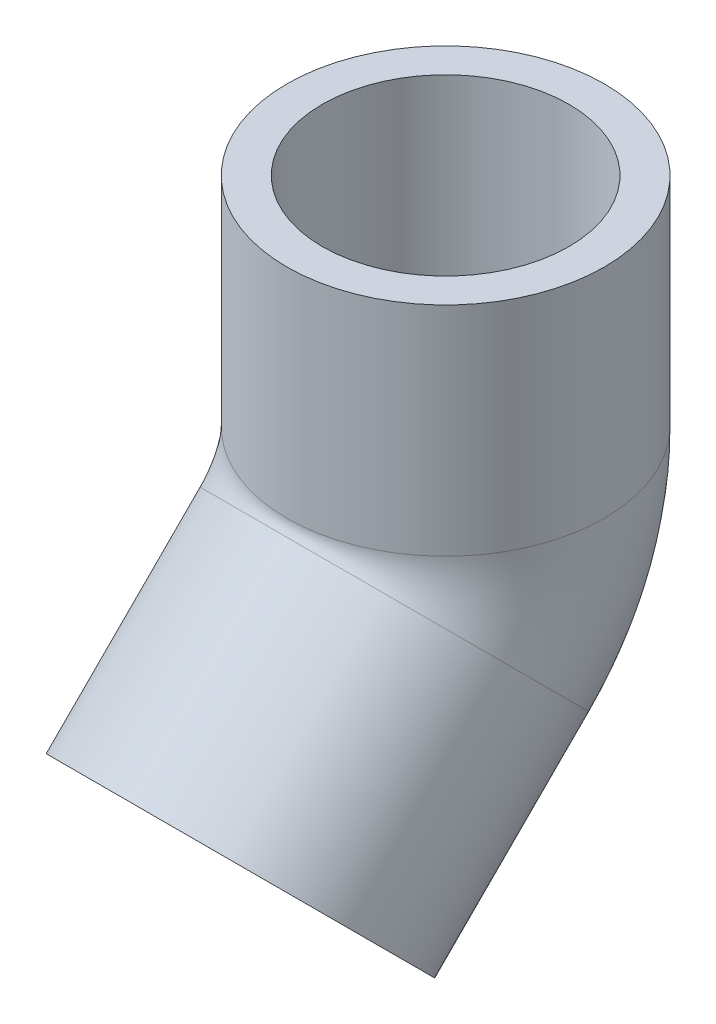
ISO-10303-21;
HEADER;
FILE_DESCRIPTION(('STEP AP214'),'2;1');
FILE_NAME('part.step','',(''),(''),'','','');
FILE_SCHEMA(('AUTOMOTIVE_DESIGN { 1 0 10303 214 1 1 1 1 }'));
ENDSEC;
DATA;
#1=APPLICATION_CONTEXT('core data for automotive mechanical design processes');
#2=APPLICATION_PROTOCOL_DEFINITION('international standard','automotive_design',2000,#1);
#3=PRODUCT_CONTEXT('',#1,'mechanical');
#4=PRODUCT('Part','Part','',(#3));
#5=PRODUCT_RELATED_PRODUCT_CATEGORY('part','',(#4));
#6=PRODUCT_DEFINITION_FORMATION('','',#4);
#7=PRODUCT_DEFINITION_CONTEXT('part definition',#1,'design');
#8=PRODUCT_DEFINITION('design','',#6,#7);
#9=PRODUCT_DEFINITION_SHAPE('','',#8);
#10=(LENGTH_UNIT() NAMED_UNIT(*) SI_UNIT(.MILLI.,.METRE.));
#11=(NAMED_UNIT(*) PLANE_ANGLE_UNIT() SI_UNIT($,.RADIAN.));
#12=(NAMED_UNIT(*) SI_UNIT($,.STERADIAN.) SOLID_ANGLE_UNIT());
#13=UNCERTAINTY_MEASURE_WITH_UNIT(LENGTH_MEASURE(1.E-05),#10,'distance_accuracy_value','');
#14=(GEOMETRIC_REPRESENTATION_CONTEXT(3) GLOBAL_UNCERTAINTY_ASSIGNED_CONTEXT((#13)) GLOBAL_UNIT_ASSIGNED_CONTEXT((#10,
#11,#12)) REPRESENTATION_CONTEXT('',''));
#15=CARTESIAN_POINT('',(0.,0.,0.));
#16=DIRECTION('',(0.,0.,1.));
#17=DIRECTION('',(1.,0.,0.));
#18=AXIS2_PLACEMENT_3D('',#15,#16,#17);
#19=CARTESIAN_POINT('',(0.,25.4,0.));
#20=DIRECTION('',(0.,-1.,0.));
#21=DIRECTION('',(0.,0.,-1.));
#22=AXIS2_PLACEMENT_3D('',#19,#20,#21);
#23=CYLINDRICAL_SURFACE('',#22,13.890625);
#24=CARTESIAN_POINT('',(0.,6.35,0.));
#25=DIRECTION('',(0.,1.,0.));
#26=DIRECTION('',(0.,0.,1.));
#27=AXIS2_PLACEMENT_3D('',#24,#25,#26);
#28=CIRCLE('',#27,13.890625);
#29=CARTESIAN_POINT('',(0.,6.35,-13.890625));
#30=VERTEX_POINT('',#29);
#31=EDGE_CURVE('E58',#30,#30,#28,.T.);
#32=ORIENTED_EDGE('',*,*,#31,.T.);
#33=EDGE_LOOP('',(#32));
#34=FACE_BOUND('',#33,.T.);
#35=CARTESIAN_POINT('',(0.,25.4,0.));
#36=DIRECTION('',(0.,1.,0.));
#37=DIRECTION('',(0.,0.,1.));
#38=AXIS2_PLACEMENT_3D('',#35,#36,#37);
#39=CIRCLE('',#38,13.890625);
#40=CARTESIAN_POINT('',(0.,25.4,13.890625));
#41=VERTEX_POINT('',#40);
#42=EDGE_CURVE('E41',#41,#41,#39,.T.);
#43=ORIENTED_EDGE('',*,*,#42,.F.);
#44=EDGE_LOOP('',(#43));
#45=FACE_BOUND('',#44,.T.);
#46=ADVANCED_FACE('F32',(#34,#45),#23,.T.);
#47=CARTESIAN_POINT('',(0.,6.35,15.3302561210691));
#48=DIRECTION('',(-1.,0.,0.));
#49=DIRECTION('',(0.,0.,1.));
#50=AXIS2_PLACEMENT_3D('',#47,#48,#49);
#51=TOROIDAL_SURFACE('',#50,15.3302561210691,13.890625);
#52=CARTESIAN_POINT('',(0.,-4.49012806053457,4.49012806053457));
#53=DIRECTION('',(0.,0.707106781186548,-0.707106781186548));
#54=DIRECTION('',(0.,0.707106781186547,0.707106781186547));
#55=AXIS2_PLACEMENT_3D('',#52,#53,#54);
#56=CIRCLE('',#55,13.890625);
#57=CARTESIAN_POINT('',(0.,-14.3122831929539,-5.33202707188482));
#58=VERTEX_POINT('',#57);
#59=EDGE_CURVE('E36',#58,#58,#56,.T.);
#60=CARTESIAN_POINT('',(0.,6.35,15.3302561210691));
#61=DIRECTION('',(-1.,0.,0.));
#62=DIRECTION('',(0.,0.,1.));
#63=AXIS2_PLACEMENT_3D('',#60,#61,#62);
#64=CIRCLE('',#63,29.2208811210691);
#65=EDGE_CURVE('',#30,#58,#64,.T.);
#66=ORIENTED_EDGE('',*,*,#31,.F.);
#67=ORIENTED_EDGE('',*,*,#59,.T.);
#68=ORIENTED_EDGE('',*,*,#65,.T.);
#69=ORIENTED_EDGE('',*,*,#65,.F.);
#70=EDGE_LOOP('',(#66,#68,#67,#69));
#71=FACE_BOUND('',#70,.T.);
#72=ADVANCED_FACE('F54',(#71),#51,.T.);
#73=CARTESIAN_POINT('',(0.,-4.49012806053457,4.49012806053456));
#74=DIRECTION('',(0.,-0.707106781186556,0.707106781186539));
#75=DIRECTION('',(0.,-0.707106781186539,-0.707106781186556));
#76=AXIS2_PLACEMENT_3D('',#73,#74,#75);
#77=CYLINDRICAL_SURFACE('',#76,13.890625);
#78=CARTESIAN_POINT('',(0.,-17.9605122421385,17.9605122421381));
#79=DIRECTION('',(0.,0.707106781186556,-0.707106781186539));
#80=DIRECTION('',(0.,0.707106781186539,0.707106781186556));
#81=AXIS2_PLACEMENT_3D('',#78,#79,#80);
#82=CIRCLE('',#81,13.890625);
#83=CARTESIAN_POINT('',(0.,-8.1383571097192,27.7826673745576));
#84=VERTEX_POINT('',#83);
#85=EDGE_CURVE('E11',#84,#84,#82,.T.);
#86=ORIENTED_EDGE('',*,*,#85,.T.);
#87=EDGE_LOOP('',(#86));
#88=FACE_BOUND('',#87,.T.);
#89=ORIENTED_EDGE('',*,*,#59,.F.);
#90=EDGE_LOOP('',(#89));
#91=FACE_BOUND('',#90,.T.);
#92=ADVANCED_FACE('F34',(#88,#91),#77,.T.);
#93=CARTESIAN_POINT('',(0.,25.4,0.));
#94=DIRECTION('',(0.,1.,0.));
#95=DIRECTION('',(0.,0.,1.));
#96=AXIS2_PLACEMENT_3D('',#93,#94,#95);
#97=PLANE('',#96);
#98=CARTESIAN_POINT('',(0.,25.4,0.));
#99=DIRECTION('',(0.,1.,0.));
#100=DIRECTION('',(0.,0.,1.));
#101=AXIS2_PLACEMENT_3D('',#98,#99,#100);
#102=CIRCLE('',#101,10.795);
#103=CARTESIAN_POINT('',(0.,25.4,10.795));
#104=VERTEX_POINT('',#103);
#105=EDGE_CURVE('E68',#104,#104,#102,.T.);
#106=ORIENTED_EDGE('',*,*,#105,.F.);
#107=EDGE_LOOP('',(#106));
#108=FACE_BOUND('',#107,.T.);
#109=ORIENTED_EDGE('',*,*,#42,.T.);
#110=EDGE_LOOP('',(#109));
#111=FACE_BOUND('',#110,.T.);
#112=ADVANCED_FACE('F53',(#108,#111),#97,.T.);
#113=CARTESIAN_POINT('',(0.,-17.9605122421385,17.9605122421381));
#114=DIRECTION('',(0.,0.707106781186556,-0.707106781186539));
#115=DIRECTION('',(0.,0.707106781186539,0.707106781186556));
#116=AXIS2_PLACEMENT_3D('',#113,#114,#115);
#117=PLANE('',#116);
#118=CARTESIAN_POINT('',(0.,-17.9605122421385,17.9605122421381));
#119=DIRECTION('',(0.,-0.707106781186556,0.707106781186539));
#120=DIRECTION('',(0.,-0.707106781186539,-0.707106781186556));
#121=AXIS2_PLACEMENT_3D('',#118,#119,#120);
#122=CIRCLE('',#121,10.795);
#123=CARTESIAN_POINT('',(0.,-25.5937299450472,10.3272945392293));
#124=VERTEX_POINT('',#123);
#125=EDGE_CURVE('E77',#124,#124,#122,.T.);
#126=ORIENTED_EDGE('',*,*,#125,.F.);
#127=EDGE_LOOP('',(#126));
#128=FACE_BOUND('',#127,.T.);
#129=ORIENTED_EDGE('',*,*,#85,.F.);
#130=EDGE_LOOP('',(#129));
#131=FACE_BOUND('',#130,.T.);
#132=ADVANCED_FACE('F49',(#128,#131),#117,.F.);
#133=CARTESIAN_POINT('',(0.,6.35,15.3302561210691));
#134=DIRECTION('',(-1.,0.,0.));
#135=DIRECTION('',(0.,0.,1.));
#136=AXIS2_PLACEMENT_3D('',#133,#134,#135);
#137=TOROIDAL_SURFACE('',#136,15.3302561210691,7.8994);
#138=CARTESIAN_POINT('',(0.,6.35,0.));
#139=DIRECTION('',(0.,1.,0.));
#140=DIRECTION('',(0.,0.,1.));
#141=AXIS2_PLACEMENT_3D('',#138,#139,#140);
#142=CIRCLE('',#141,7.8994);
#143=CARTESIAN_POINT('',(0.,6.35,-7.8994));
#144=VERTEX_POINT('',#143);
#145=EDGE_CURVE('E61',#144,#144,#142,.F.);
#146=CARTESIAN_POINT('',(0.,-4.49012806053458,4.49012806053458));
#147=DIRECTION('',(0.,-0.707106781186556,0.707106781186539));
#148=DIRECTION('',(0.,-0.707106781186539,-0.707106781186556));
#149=AXIS2_PLACEMENT_3D('',#146,#147,#148);
#150=CIRCLE('',#149,7.8994);
#151=CARTESIAN_POINT('',(0.,-10.0758473678396,-1.09559124677043));
#152=VERTEX_POINT('',#151);
#153=EDGE_CURVE('E71',#152,#152,#150,.F.);
#154=CARTESIAN_POINT('',(0.,6.35,15.3302561210691));
#155=DIRECTION('',(-1.,0.,0.));
#156=DIRECTION('',(0.,0.,1.));
#157=AXIS2_PLACEMENT_3D('',#154,#155,#156);
#158=CIRCLE('',#157,23.2296561210691);
#159=EDGE_CURVE('',#144,#152,#158,.T.);
#160=ORIENTED_EDGE('',*,*,#145,.F.);
#161=ORIENTED_EDGE('',*,*,#153,.F.);
#162=ORIENTED_EDGE('',*,*,#159,.T.);
#163=ORIENTED_EDGE('',*,*,#159,.F.);
#164=EDGE_LOOP('',(#160,#162,#161,#163));
#165=FACE_BOUND('',#164,.T.);
#166=ADVANCED_FACE('F93',(#165),#137,.F.);
#167=CARTESIAN_POINT('',(0.,6.35,0.));
#168=DIRECTION('',(0.,1.,0.));
#169=DIRECTION('',(0.,0.,1.));
#170=AXIS2_PLACEMENT_3D('',#167,#168,#169);
#171=PLANE('',#170);
#172=CARTESIAN_POINT('',(0.,6.35,0.));
#173=DIRECTION('',(0.,1.,0.));
#174=DIRECTION('',(0.,0.,1.));
#175=AXIS2_PLACEMENT_3D('',#172,#173,#174);
#176=CIRCLE('',#175,10.795);
#177=CARTESIAN_POINT('',(0.,6.35,10.795));
#178=VERTEX_POINT('',#177);
#179=EDGE_CURVE('E65',#178,#178,#176,.T.);
#180=ORIENTED_EDGE('',*,*,#179,.T.);
#181=EDGE_LOOP('',(#180));
#182=FACE_BOUND('',#181,.T.);
#183=ORIENTED_EDGE('',*,*,#145,.T.);
#184=EDGE_LOOP('',(#183));
#185=FACE_BOUND('',#184,.T.);
#186=ADVANCED_FACE('F99',(#182,#185),#171,.T.);
#187=CARTESIAN_POINT('',(0.,6.35,0.));
#188=DIRECTION('',(0.,1.,0.));
#189=DIRECTION('',(0.,0.,1.));
#190=AXIS2_PLACEMENT_3D('',#187,#188,#189);
#191=CYLINDRICAL_SURFACE('',#190,10.795);
#192=CARTESIAN_POINT('',(0.,6.35,10.795));
#193=CARTESIAN_POINT('',(0.,6.5484375,10.795));
#194=CARTESIAN_POINT('',(0.,6.746875,10.795));
#195=CARTESIAN_POINT('',(0.,7.14375,10.795));
#196=CARTESIAN_POINT('',(0.,7.3421875,10.795));
#197=CARTESIAN_POINT('',(0.,7.7390625,10.795));
#198=CARTESIAN_POINT('',(0.,7.9375,10.795));
#199=CARTESIAN_POINT('',(0.,8.334375,10.795));
#200=CARTESIAN_POINT('',(0.,8.5328125,10.795));
#201=CARTESIAN_POINT('',(0.,8.9296875,10.795));
#202=CARTESIAN_POINT('',(0.,9.128125,10.795));
#203=CARTESIAN_POINT('',(0.,9.525,10.795));
#204=CARTESIAN_POINT('',(0.,9.7234375,10.795));
#205=CARTESIAN_POINT('',(0.,10.1203125,10.795));
#206=CARTESIAN_POINT('',(0.,10.31875,10.795));
#207=CARTESIAN_POINT('',(0.,10.715625,10.795));
#208=CARTESIAN_POINT('',(0.,10.9140625,10.795));
#209=CARTESIAN_POINT('',(0.,11.3109375,10.795));
#210=CARTESIAN_POINT('',(0.,11.509375,10.795));
#211=CARTESIAN_POINT('',(0.,11.90625,10.795));
#212=CARTESIAN_POINT('',(0.,12.1046875,10.795));
#213=CARTESIAN_POINT('',(0.,12.5015625,10.795));
#214=CARTESIAN_POINT('',(0.,12.7,10.795));
#215=CARTESIAN_POINT('',(0.,13.096875,10.795));
#216=CARTESIAN_POINT('',(0.,13.2953125,10.795));
#217=CARTESIAN_POINT('',(0.,13.6921875,10.795));
#218=CARTESIAN_POINT('',(0.,13.890625,10.795));
#219=CARTESIAN_POINT('',(0.,14.2875,10.795));
#220=CARTESIAN_POINT('',(0.,14.4859375,10.795));
#221=CARTESIAN_POINT('',(0.,14.8828125,10.795));
#222=CARTESIAN_POINT('',(0.,15.08125,10.795));
#223=CARTESIAN_POINT('',(0.,15.478125,10.795));
#224=CARTESIAN_POINT('',(0.,15.6765625,10.795));
#225=CARTESIAN_POINT('',(0.,16.0734375,10.795));
#226=CARTESIAN_POINT('',(0.,16.271875,10.795));
#227=CARTESIAN_POINT('',(0.,16.66875,10.795));
#228=CARTESIAN_POINT('',(0.,16.8671875,10.795));
#229=CARTESIAN_POINT('',(0.,17.2640625,10.795));
#230=CARTESIAN_POINT('',(0.,17.4625,10.795));
#231=CARTESIAN_POINT('',(0.,17.859375,10.795));
#232=CARTESIAN_POINT('',(0.,18.0578125,10.795));
#233=CARTESIAN_POINT('',(0.,18.4546875,10.795));
#234=CARTESIAN_POINT('',(0.,18.653125,10.795));
#235=CARTESIAN_POINT('',(0.,19.05,10.795));
#236=CARTESIAN_POINT('',(0.,19.2484375,10.795));
#237=CARTESIAN_POINT('',(0.,19.6453125,10.795));
#238=CARTESIAN_POINT('',(0.,19.84375,10.795));
#239=CARTESIAN_POINT('',(0.,20.240625,10.795));
#240=CARTESIAN_POINT('',(0.,20.4390625,10.795));
#241=CARTESIAN_POINT('',(0.,20.8359375,10.795));
#242=CARTESIAN_POINT('',(0.,21.034375,10.795));
#243=CARTESIAN_POINT('',(0.,21.43125,10.795));
#244=CARTESIAN_POINT('',(0.,21.6296875,10.795));
#245=CARTESIAN_POINT('',(0.,22.0265625,10.795));
#246=CARTESIAN_POINT('',(0.,22.225,10.795));
#247=CARTESIAN_POINT('',(0.,22.621875,10.795));
#248=CARTESIAN_POINT('',(0.,22.8203125,10.795));
#249=CARTESIAN_POINT('',(0.,23.2171875,10.795));
#250=CARTESIAN_POINT('',(0.,23.415625,10.795));
#251=CARTESIAN_POINT('',(0.,23.8125,10.795));
#252=CARTESIAN_POINT('',(0.,24.0109375,10.795));
#253=CARTESIAN_POINT('',(0.,24.4078125,10.795));
#254=CARTESIAN_POINT('',(0.,24.60625,10.795));
#255=CARTESIAN_POINT('',(0.,25.003125,10.795));
#256=CARTESIAN_POINT('',(0.,25.2015625,10.795));
#257=CARTESIAN_POINT('',(0.,25.4,10.795));
#258=B_SPLINE_CURVE_WITH_KNOTS('',3,(#192,#193,#194,#195,#196,#197,#198,#199,#200,#201,#202,
#203,#204,#205,#206,#207,#208,#209,#210,#211,#212,#213,#214,#215,#216,#217,#218,#219,#220,#221,
#222,#223,#224,#225,#226,#227,#228,#229,#230,#231,#232,#233,#234,#235,#236,#237,#238,#239,#240,
#241,#242,#243,#244,#245,#246,#247,#248,#249,#250,#251,#252,#253,#254,#255,#256,#257),
.UNSPECIFIED.,.F.,.F.,(4,2,2,2,2,2,2,2,2,2,2,2,2,2,2,2,2,2,2,2,2,2,2,2,2,2,2,2,2,2,2,2,4),(0.,
0.595312499999999,1.190625,1.7859375,2.38125,2.9765625,3.571875,4.1671875,4.7625,5.3578125,
5.953125,6.5484375,7.14375,7.7390625,8.334375,8.9296875,9.525,10.1203125,10.715625,11.3109375,
11.90625,12.5015625,13.096875,13.6921875,14.2875,14.8828125,15.478125,16.0734375,16.66875,
17.2640625,17.859375,18.4546875,19.05),.UNSPECIFIED.);
#259=EDGE_CURVE('BSEAM134',#178,#104,#258,.T.);
#260=ORIENTED_EDGE('',*,*,#179,.F.);
#261=ORIENTED_EDGE('',*,*,#105,.T.);
#262=ORIENTED_EDGE('',*,*,#259,.T.);
#263=ORIENTED_EDGE('',*,*,#259,.F.);
#264=EDGE_LOOP('',(#260,#262,#261,#263));
#265=FACE_BOUND('',#264,.T.);
#266=ADVANCED_FACE('F134',(#265),#191,.F.);
#267=CARTESIAN_POINT('',(0.,-4.49012806053458,4.49012806053458));
#268=DIRECTION('',(0.,-0.707106781186556,0.707106781186539));
#269=DIRECTION('',(0.,-0.707106781186539,-0.707106781186556));
#270=AXIS2_PLACEMENT_3D('',#267,#268,#269);
#271=PLANE('',#270);
#272=CARTESIAN_POINT('',(0.,-4.49012806053458,4.49012806053458));
#273=DIRECTION('',(0.,-0.707106781186556,0.707106781186539));
#274=DIRECTION('',(0.,-0.707106781186539,-0.707106781186556));
#275=AXIS2_PLACEMENT_3D('',#272,#273,#274);
#276=CIRCLE('',#275,10.795);
#277=CARTESIAN_POINT('',(0.,-12.1233457634433,-3.1430896423743));
#278=VERTEX_POINT('',#277);
#279=EDGE_CURVE('E76',#278,#278,#276,.T.);
#280=ORIENTED_EDGE('',*,*,#279,.T.);
#281=EDGE_LOOP('',(#280));
#282=FACE_BOUND('',#281,.T.);
#283=ORIENTED_EDGE('',*,*,#153,.T.);
#284=EDGE_LOOP('',(#283));
#285=FACE_BOUND('',#284,.T.);
#286=ADVANCED_FACE('F83',(#282,#285),#271,.T.);
#287=CARTESIAN_POINT('',(0.,-4.49012806053458,4.49012806053458));
#288=DIRECTION('',(0.,-0.707106781186556,0.707106781186539));
#289=DIRECTION('',(0.,-0.707106781186539,-0.707106781186556));
#290=AXIS2_PLACEMENT_3D('',#287,#288,#289);
#291=CYLINDRICAL_SURFACE('',#290,10.795);
#292=ORIENTED_EDGE('',*,*,#279,.F.);
#293=EDGE_LOOP('',(#292));
#294=FACE_BOUND('',#293,.T.);
#295=ORIENTED_EDGE('',*,*,#125,.T.);
#296=EDGE_LOOP('',(#295));
#297=FACE_BOUND('',#296,.T.);
#298=ADVANCED_FACE('F86',(#294,#297),#291,.F.);
#299=CLOSED_SHELL('',(#46,#72,#92,#112,#132,#166,#186,#266,#286,#298));
#300=MANIFOLD_SOLID_BREP('B2',#299);
#301=ADVANCED_BREP_SHAPE_REPRESENTATION('',(#18,#300),#14);
#302=SHAPE_DEFINITION_REPRESENTATION(#9,#301);
ENDSEC;
END-ISO-10303-21;
